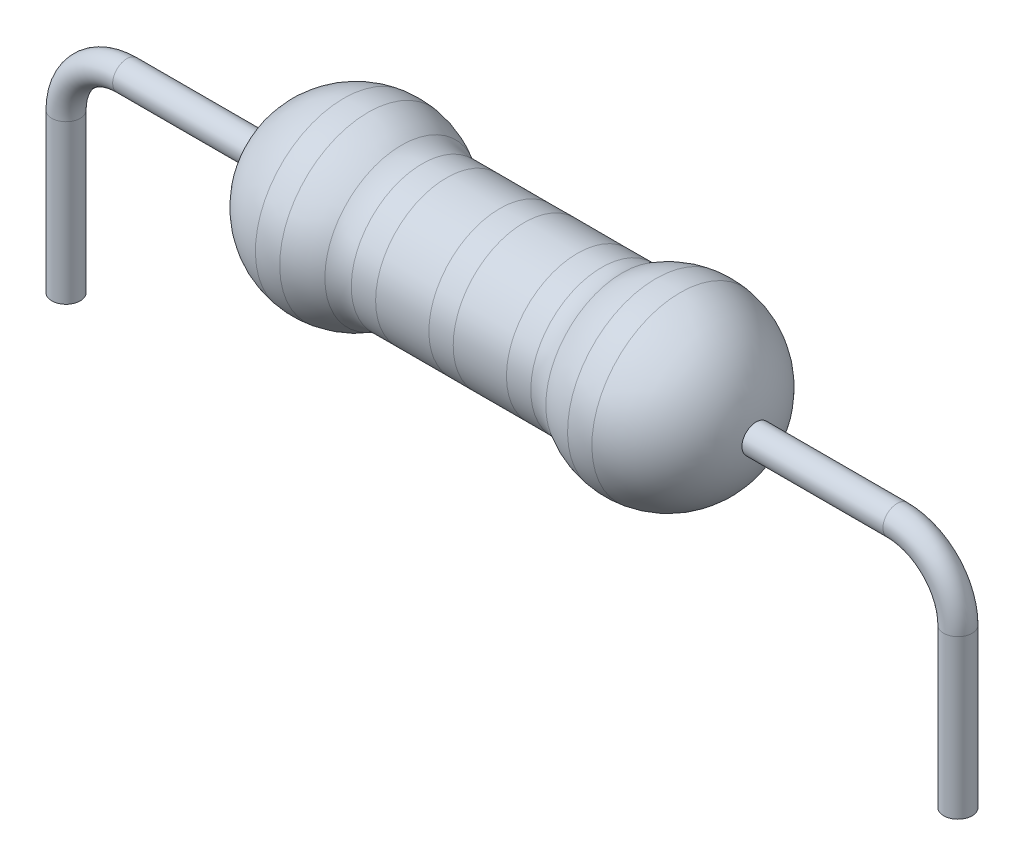
ISO-10303-21;
HEADER;
FILE_DESCRIPTION(('STEP AP214'),'2;1');
FILE_NAME('part.step','',(''),(''),'','','');
FILE_SCHEMA(('AUTOMOTIVE_DESIGN { 1 0 10303 214 1 1 1 1 }'));
ENDSEC;
DATA;
#1=APPLICATION_CONTEXT('core data for automotive mechanical design processes');
#2=APPLICATION_PROTOCOL_DEFINITION('international standard','automotive_design',2000,#1);
#3=PRODUCT_CONTEXT('',#1,'mechanical');
#4=PRODUCT('Part','Part','',(#3));
#5=PRODUCT_RELATED_PRODUCT_CATEGORY('part','',(#4));
#6=PRODUCT_DEFINITION_FORMATION('','',#4);
#7=PRODUCT_DEFINITION_CONTEXT('part definition',#1,'design');
#8=PRODUCT_DEFINITION('design','',#6,#7);
#9=PRODUCT_DEFINITION_SHAPE('','',#8);
#10=(LENGTH_UNIT() NAMED_UNIT(*) SI_UNIT(.MILLI.,.METRE.));
#11=(NAMED_UNIT(*) PLANE_ANGLE_UNIT() SI_UNIT($,.RADIAN.));
#12=(NAMED_UNIT(*) SI_UNIT($,.STERADIAN.) SOLID_ANGLE_UNIT());
#13=UNCERTAINTY_MEASURE_WITH_UNIT(LENGTH_MEASURE(1.E-05),#10,'distance_accuracy_value','');
#14=(GEOMETRIC_REPRESENTATION_CONTEXT(3) GLOBAL_UNCERTAINTY_ASSIGNED_CONTEXT((#13)) GLOBAL_UNIT_ASSIGNED_CONTEXT((#10,
#11,#12)) REPRESENTATION_CONTEXT('',''));
#15=CARTESIAN_POINT('',(0.,0.,0.));
#16=DIRECTION('',(0.,0.,1.));
#17=DIRECTION('',(1.,0.,0.));
#18=AXIS2_PLACEMENT_3D('',#15,#16,#17);
#19=CARTESIAN_POINT('',(-4.74999995071284,0.,0.));
#20=DIRECTION('',(1.,0.,0.));
#21=DIRECTION('',(0.,0.,-1.));
#22=AXIS2_PLACEMENT_3D('',#19,#20,#21);
#23=CYLINDRICAL_SURFACE('',#22,0.175);
#24=CARTESIAN_POINT('',(-3.01099033144867,0.,0.));
#25=DIRECTION('',(1.,0.,0.));
#26=DIRECTION('',(0.,1.,0.));
#27=AXIS2_PLACEMENT_3D('',#24,#25,#26);
#28=CIRCLE('',#27,0.175);
#29=CARTESIAN_POINT('',(-3.01099033144867,0.174999999999999,0.));
#30=VERTEX_POINT('',#29);
#31=EDGE_CURVE('E75',#30,#30,#28,.T.);
#32=ORIENTED_EDGE('',*,*,#31,.F.);
#33=EDGE_LOOP('',(#32));
#34=FACE_BOUND('',#33,.T.);
#35=CARTESIAN_POINT('',(-4.74999995071284,0.,0.));
#36=DIRECTION('',(0.999999999999991,-1.31432424244821E-07,0.));
#37=DIRECTION('',(1.31432424244821E-07,0.999999999999991,0.));
#38=AXIS2_PLACEMENT_3D('',#35,#36,#37);
#39=CIRCLE('',#38,0.175);
#40=CARTESIAN_POINT('',(-4.7499999392125,0.174999999999997,0.));
#41=VERTEX_POINT('',#40);
#42=EDGE_CURVE('E12',#41,#41,#39,.T.);
#43=ORIENTED_EDGE('',*,*,#42,.T.);
#44=EDGE_LOOP('',(#43));
#45=FACE_BOUND('',#44,.T.);
#46=ADVANCED_FACE('F46',(#34,#45),#23,.T.);
#47=CARTESIAN_POINT('',(-3.01099033144867,0.,0.));
#48=DIRECTION('',(1.,0.,0.));
#49=DIRECTION('',(0.,0.,-1.));
#50=AXIS2_PLACEMENT_3D('',#47,#48,#49);
#51=CYLINDRICAL_SURFACE('',#50,0.175);
#52=CARTESIAN_POINT('',(3.01099033144868,0.,0.));
#53=DIRECTION('',(1.,0.,0.));
#54=DIRECTION('',(0.,1.,0.));
#55=AXIS2_PLACEMENT_3D('',#52,#53,#54);
#56=CIRCLE('',#55,0.175);
#57=CARTESIAN_POINT('',(3.01099033144868,0.174999999999999,0.));
#58=VERTEX_POINT('',#57);
#59=EDGE_CURVE('E78',#58,#58,#56,.T.);
#60=ORIENTED_EDGE('',*,*,#59,.F.);
#61=EDGE_LOOP('',(#60));
#62=FACE_BOUND('',#61,.T.);
#63=ORIENTED_EDGE('',*,*,#31,.T.);
#64=EDGE_LOOP('',(#63));
#65=FACE_BOUND('',#64,.T.);
#66=ADVANCED_FACE('F89',(#62,#65),#51,.T.);
#67=CARTESIAN_POINT('',(3.01099033144868,0.,0.));
#68=DIRECTION('',(1.,0.,0.));
#69=DIRECTION('',(0.,0.,-1.));
#70=AXIS2_PLACEMENT_3D('',#67,#68,#69);
#71=CYLINDRICAL_SURFACE('',#70,0.175);
#72=CARTESIAN_POINT('',(4.74999995071284,0.,0.));
#73=DIRECTION('',(1.,0.,0.));
#74=DIRECTION('',(0.,1.,0.));
#75=AXIS2_PLACEMENT_3D('',#72,#73,#74);
#76=CIRCLE('',#75,0.175);
#77=CARTESIAN_POINT('',(4.74999995071284,0.174999999999999,0.));
#78=VERTEX_POINT('',#77);
#79=EDGE_CURVE('E71',#78,#78,#76,.T.);
#80=ORIENTED_EDGE('',*,*,#79,.F.);
#81=EDGE_LOOP('',(#80));
#82=FACE_BOUND('',#81,.T.);
#83=ORIENTED_EDGE('',*,*,#59,.T.);
#84=EDGE_LOOP('',(#83));
#85=FACE_BOUND('',#84,.T.);
#86=ADVANCED_FACE('F86',(#82,#85),#71,.T.);
#87=CARTESIAN_POINT('',(4.74999995071284,-0.75,0.));
#88=DIRECTION('',(0.,0.,-1.));
#89=DIRECTION('',(-1.,0.,0.));
#90=AXIS2_PLACEMENT_3D('',#87,#88,#89);
#91=TOROIDAL_SURFACE('',#90,0.749999999999998,0.175);
#92=CARTESIAN_POINT('',(5.49999995071284,-0.750000000000002,0.));
#93=DIRECTION('',(0.,-1.,0.));
#94=DIRECTION('',(1.,0.,0.));
#95=AXIS2_PLACEMENT_3D('',#92,#93,#94);
#96=CIRCLE('',#95,0.175);
#97=CARTESIAN_POINT('',(5.67499995071284,-0.750000000000003,0.));
#98=VERTEX_POINT('',#97);
#99=EDGE_CURVE('E68',#98,#98,#96,.T.);
#100=CARTESIAN_POINT('',(4.74999995071284,-0.75,0.));
#101=DIRECTION('',(0.,0.,-1.));
#102=DIRECTION('',(-1.,0.,0.));
#103=AXIS2_PLACEMENT_3D('',#100,#101,#102);
#104=CIRCLE('',#103,0.924999999999999);
#105=EDGE_CURVE('',#78,#98,#104,.T.);
#106=ORIENTED_EDGE('',*,*,#79,.T.);
#107=ORIENTED_EDGE('',*,*,#99,.F.);
#108=ORIENTED_EDGE('',*,*,#105,.T.);
#109=ORIENTED_EDGE('',*,*,#105,.F.);
#110=EDGE_LOOP('',(#106,#108,#107,#109));
#111=FACE_BOUND('',#110,.T.);
#112=ADVANCED_FACE('F84',(#111),#91,.T.);
#113=CARTESIAN_POINT('',(5.49999995071284,-0.750000000000002,0.));
#114=DIRECTION('',(0.,-1.,0.));
#115=DIRECTION('',(0.,0.,-1.));
#116=AXIS2_PLACEMENT_3D('',#113,#114,#115);
#117=CYLINDRICAL_SURFACE('',#116,0.175);
#118=CARTESIAN_POINT('',(5.49999995071284,-2.7,0.));
#119=DIRECTION('',(0.,1.,0.));
#120=DIRECTION('',(-1.,0.,0.));
#121=AXIS2_PLACEMENT_3D('',#118,#119,#120);
#122=CIRCLE('',#121,0.175);
#123=CARTESIAN_POINT('',(5.32499995071284,-2.7,0.));
#124=VERTEX_POINT('',#123);
#125=EDGE_CURVE('E73',#124,#124,#122,.F.);
#126=ORIENTED_EDGE('',*,*,#125,.F.);
#127=EDGE_LOOP('',(#126));
#128=FACE_BOUND('',#127,.T.);
#129=ORIENTED_EDGE('',*,*,#99,.T.);
#130=EDGE_LOOP('',(#129));
#131=FACE_BOUND('',#130,.T.);
#132=ADVANCED_FACE('F48',(#128,#131),#117,.T.);
#133=CARTESIAN_POINT('',(-5.50000004928716,-8.7,0.));
#134=DIRECTION('',(0.,1.,0.));
#135=DIRECTION('',(-1.,0.,0.));
#136=AXIS2_PLACEMENT_3D('',#133,#134,#135);
#137=CYLINDRICAL_SURFACE('',#136,0.175);
#138=CARTESIAN_POINT('',(-5.50000004928716,-2.7,0.));
#139=DIRECTION('',(0.,1.,0.));
#140=DIRECTION('',(-1.,0.,0.));
#141=AXIS2_PLACEMENT_3D('',#138,#139,#140);
#142=CIRCLE('',#141,0.175);
#143=CARTESIAN_POINT('',(-5.67500004928716,-2.7,0.));
#144=VERTEX_POINT('',#143);
#145=EDGE_CURVE('E50',#144,#144,#142,.F.);
#146=ORIENTED_EDGE('',*,*,#145,.F.);
#147=EDGE_LOOP('',(#146));
#148=FACE_BOUND('',#147,.T.);
#149=CARTESIAN_POINT('',(-5.50000004928716,-0.750000000000001,0.));
#150=DIRECTION('',(0.,1.,0.));
#151=DIRECTION('',(-1.,0.,0.));
#152=AXIS2_PLACEMENT_3D('',#149,#150,#151);
#153=CIRCLE('',#152,0.175);
#154=CARTESIAN_POINT('',(-5.67500004928716,-0.750000000000001,0.));
#155=VERTEX_POINT('',#154);
#156=EDGE_CURVE('E54',#155,#155,#153,.T.);
#157=ORIENTED_EDGE('',*,*,#156,.F.);
#158=EDGE_LOOP('',(#157));
#159=FACE_BOUND('',#158,.T.);
#160=ADVANCED_FACE('F63',(#148,#159),#137,.T.);
#161=CARTESIAN_POINT('',(-4.75000004928716,-0.75,0.));
#162=DIRECTION('',(0.,0.,-1.));
#163=DIRECTION('',(-1.,0.,0.));
#164=AXIS2_PLACEMENT_3D('',#161,#162,#163);
#165=TOROIDAL_SURFACE('',#164,0.750000000000003,0.175);
#166=ORIENTED_EDGE('',*,*,#42,.F.);
#167=EDGE_LOOP('',(#166));
#168=FACE_BOUND('',#167,.T.);
#169=ORIENTED_EDGE('',*,*,#156,.T.);
#170=EDGE_LOOP('',(#169));
#171=FACE_BOUND('',#170,.T.);
#172=ADVANCED_FACE('F59',(#168,#171),#165,.T.);
#173=CARTESIAN_POINT('',(0.,-2.7,0.));
#174=DIRECTION('',(0.,1.,0.));
#175=DIRECTION('',(-1.,0.,0.));
#176=AXIS2_PLACEMENT_3D('',#173,#174,#175);
#177=PLANE('',#176);
#178=ORIENTED_EDGE('',*,*,#145,.T.);
#179=EDGE_LOOP('',(#178));
#180=FACE_BOUND('',#179,.T.);
#181=ADVANCED_FACE('F62',(#180),#177,.F.);
#182=ORIENTED_EDGE('',*,*,#125,.T.);
#183=EDGE_LOOP('',(#182));
#184=FACE_BOUND('',#183,.T.);
#185=ADVANCED_FACE('F103',(#184),#177,.F.);
#186=CLOSED_SHELL('',(#46,#66,#86,#112,#132,#160,#172,#181,#185));
#187=MANIFOLD_SOLID_BREP('B2',#186);
#188=CARTESIAN_POINT('',(-3.025,0.,0.));
#189=DIRECTION('',(-1.,0.,0.));
#190=DIRECTION('',(0.,-1.,0.));
#191=AXIS2_PLACEMENT_3D('',#188,#189,#190);
#192=CYLINDRICAL_SURFACE('',#191,0.874999999999999);
#193=CARTESIAN_POINT('',(0.80684659140232,0.,0.));
#194=DIRECTION('',(1.,0.,0.));
#195=DIRECTION('',(0.,0.,-1.));
#196=AXIS2_PLACEMENT_3D('',#193,#194,#195);
#197=CIRCLE('',#196,0.874999999999999);
#198=CARTESIAN_POINT('',(0.80684659140232,0.,-0.874999999999999));
#199=VERTEX_POINT('',#198);
#200=EDGE_CURVE('E196',#199,#199,#197,.T.);
#201=ORIENTED_EDGE('',*,*,#200,.F.);
#202=EDGE_LOOP('',(#201));
#203=FACE_BOUND('',#202,.T.);
#204=CARTESIAN_POINT('',(0.15,0.,0.));
#205=DIRECTION('',(-1.,0.,0.));
#206=DIRECTION('',(0.,0.,1.));
#207=AXIS2_PLACEMENT_3D('',#204,#205,#206);
#208=CIRCLE('',#207,0.874999999999999);
#209=CARTESIAN_POINT('',(0.15,0.,0.874999999999999));
#210=VERTEX_POINT('',#209);
#211=EDGE_CURVE('E186',#210,#210,#208,.T.);
#212=ORIENTED_EDGE('',*,*,#211,.F.);
#213=EDGE_LOOP('',(#212));
#214=FACE_BOUND('',#213,.T.);
#215=ADVANCED_FACE('F175',(#203,#214),#192,.T.);
#216=CARTESIAN_POINT('',(-0.80684659140232,0.,0.));
#217=DIRECTION('',(-1.,0.,0.));
#218=DIRECTION('',(0.,0.,1.));
#219=AXIS2_PLACEMENT_3D('',#216,#217,#218);
#220=CIRCLE('',#219,0.874999999999999);
#221=CARTESIAN_POINT('',(-0.80684659140232,0.,0.874999999999999));
#222=VERTEX_POINT('',#221);
#223=EDGE_CURVE('E201',#222,#222,#220,.T.);
#224=ORIENTED_EDGE('',*,*,#223,.F.);
#225=EDGE_LOOP('',(#224));
#226=FACE_BOUND('',#225,.T.);
#227=CARTESIAN_POINT('',(-0.15,0.,0.));
#228=DIRECTION('',(1.,0.,0.));
#229=DIRECTION('',(0.,0.,-1.));
#230=AXIS2_PLACEMENT_3D('',#227,#228,#229);
#231=CIRCLE('',#230,0.874999999999999);
#232=CARTESIAN_POINT('',(-0.15,0.,-0.874999999999999));
#233=VERTEX_POINT('',#232);
#234=EDGE_CURVE('E191',#233,#233,#231,.T.);
#235=ORIENTED_EDGE('',*,*,#234,.F.);
#236=EDGE_LOOP('',(#235));
#237=FACE_BOUND('',#236,.T.);
#238=ADVANCED_FACE('F257',(#226,#237),#192,.T.);
#239=ORIENTED_EDGE('',*,*,#211,.T.);
#240=EDGE_LOOP('',(#239));
#241=FACE_BOUND('',#240,.T.);
#242=ORIENTED_EDGE('',*,*,#234,.T.);
#243=EDGE_LOOP('',(#242));
#244=FACE_BOUND('',#243,.T.);
#245=ADVANCED_FACE('F261',(#241,#244),#192,.T.);
#246=ORIENTED_EDGE('',*,*,#200,.T.);
#247=EDGE_LOOP('',(#246));
#248=FACE_BOUND('',#247,.T.);
#249=CARTESIAN_POINT('',(1.10684659140232,0.,0.));
#250=DIRECTION('',(-1.,0.,0.));
#251=DIRECTION('',(0.,-1.,0.));
#252=AXIS2_PLACEMENT_3D('',#249,#250,#251);
#253=CIRCLE('',#252,0.874999999999999);
#254=CARTESIAN_POINT('',(1.10684659140232,-0.874999999999998,0.));
#255=VERTEX_POINT('',#254);
#256=EDGE_CURVE('E224',#255,#255,#253,.T.);
#257=ORIENTED_EDGE('',*,*,#256,.T.);
#258=EDGE_LOOP('',(#257));
#259=FACE_BOUND('',#258,.T.);
#260=ADVANCED_FACE('F249',(#248,#259),#192,.T.);
#261=CARTESIAN_POINT('',(1.925,0.,0.));
#262=DIRECTION('',(-1.,0.,0.));
#263=DIRECTION('',(0.,1.,0.));
#264=AXIS2_PLACEMENT_3D('',#261,#262,#263);
#265=SPHERICAL_SURFACE('',#264,1.1);
#266=CARTESIAN_POINT('',(1.3625195315891,0.,0.));
#267=DIRECTION('',(-1.,0.,0.));
#268=DIRECTION('',(0.,-1.,0.));
#269=AXIS2_PLACEMENT_3D('',#266,#267,#268);
#270=CIRCLE('',#269,0.945312499999999);
#271=CARTESIAN_POINT('',(1.3625195315891,0.9453125,0.));
#272=VERTEX_POINT('',#271);
#273=EDGE_CURVE('E218',#272,#272,#270,.T.);
#274=CARTESIAN_POINT('',(1.775,0.,0.));
#275=DIRECTION('',(1.,0.,0.));
#276=DIRECTION('',(0.,0.,-1.));
#277=AXIS2_PLACEMENT_3D('',#274,#275,#276);
#278=CIRCLE('',#277,1.08972473588517);
#279=CARTESIAN_POINT('',(1.775,1.08972473588517,0.));
#280=VERTEX_POINT('',#279);
#281=EDGE_CURVE('E205',#280,#280,#278,.T.);
#282=CARTESIAN_POINT('',(1.3625195315891,0.9453125,0.));
#283=CARTESIAN_POINT('',(1.36645794243686,0.947655937694644,0.));
#284=CARTESIAN_POINT('',(1.3704109998934,0.949974760026797,0.));
#285=CARTESIAN_POINT('',(1.37834578695678,0.954562817835994,0.));
#286=CARTESIAN_POINT('',(1.3823275165636,0.956832053313037,0.));
#287=CARTESIAN_POINT('',(1.39031902686026,0.961320581281889,0.));
#288=CARTESIAN_POINT('',(1.39432880755009,0.963539873773696,0.));
#289=CARTESIAN_POINT('',(1.40237579336325,0.967928169519508,0.));
#290=CARTESIAN_POINT('',(1.40641299848658,0.970097172773513,0.));
#291=CARTESIAN_POINT('',(1.41451420255467,0.974384551091025,0.));
#292=CARTESIAN_POINT('',(1.41857820149942,0.976502926154533,0.));
#293=CARTESIAN_POINT('',(1.42673235832645,0.980688717196365,0.));
#294=CARTESIAN_POINT('',(1.43082251620872,0.98275613317469,0.));
#295=CARTESIAN_POINT('',(1.43902835196352,0.986839683072212,0.));
#296=CARTESIAN_POINT('',(1.44314402983604,0.98885581699141,0.));
#297=CARTESIAN_POINT('',(1.4514002626312,0.992836487818565,0.));
#298=CARTESIAN_POINT('',(1.45554081755384,0.994801024726523,0.));
#299=CARTESIAN_POINT('',(1.46384615762456,0.998678194636545,0.));
#300=CARTESIAN_POINT('',(1.46801094277263,1.00059082763861,0.));
#301=CARTESIAN_POINT('',(1.47636409268393,1.00436389095124,0.));
#302=CARTESIAN_POINT('',(1.48055245744714,1.0062243212618,0.));
#303=CARTESIAN_POINT('',(1.488952112295,1.00989268856055,0.));
#304=CARTESIAN_POINT('',(1.49316340237963,1.01170062554874,0.));
#305=CARTESIAN_POINT('',(1.50160824999525,1.01526372377228,0.));
#306=CARTESIAN_POINT('',(1.50584180752623,1.01701888500763,0.));
#307=CARTESIAN_POINT('',(1.51433052868092,1.02047615753949,0.));
#308=CARTESIAN_POINT('',(1.51858569230463,1.02217826883599,0.));
#309=CARTESIAN_POINT('',(1.52711696091591,1.02552917559144,0.));
#310=CARTESIAN_POINT('',(1.53139306590349,1.02717797105039,0.));
#311=CARTESIAN_POINT('',(1.53996554924225,1.03042198856086,0.));
#312=CARTESIAN_POINT('',(1.54426192759343,1.03201721061239,0.));
#313=CARTESIAN_POINT('',(1.55287428649211,1.03515383210724,0.));
#314=CARTESIAN_POINT('',(1.55719026703961,1.03669523155055,0.));
#315=CARTESIAN_POINT('',(1.56584115610141,1.03972396703619,0.));
#316=CARTESIAN_POINT('',(1.57017606461572,1.04121130307852,0.));
#317=CARTESIAN_POINT('',(1.57886413242478,1.04413167941501,0.));
#318=CARTESIAN_POINT('',(1.58321729171954,1.04556471970917,0.));
#319=CARTESIAN_POINT('',(1.59194118105204,1.04837628068411,0.));
#320=CARTESIAN_POINT('',(1.5963119110898,1.04975480136487,0.));
#321=CARTESIAN_POINT('',(1.605070259126,1.05245710776466,0.));
#322=CARTESIAN_POINT('',(1.60945787712445,1.05378089348367,0.));
#323=CARTESIAN_POINT('',(1.61824931566158,1.05637352316212,0.));
#324=CARTESIAN_POINT('',(1.62265313620024,1.05764236712156,0.));
#325=CARTESIAN_POINT('',(1.6314762918662,1.06012491506588,0.));
#326=CARTESIAN_POINT('',(1.6358956269935,1.06133861905076,0.));
#327=CARTESIAN_POINT('',(1.64474912146146,1.06371069744476,0.));
#328=CARTESIAN_POINT('',(1.64918328080214,1.06486907185388,0.));
#329=CARTESIAN_POINT('',(1.65806573100583,1.06713031013866,0.));
#330=CARTESIAN_POINT('',(1.66251402186885,1.06823317401431,0.));
#331=CARTESIAN_POINT('',(1.67142404021865,1.07038321894587,0.));
#332=CARTESIAN_POINT('',(1.67588576770542,1.07143040000179,0.));
#333=CARTESIAN_POINT('',(1.68482196230499,1.0734689157071,0.));
#334=CARTESIAN_POINT('',(1.68929642941777,1.0744602503565,0.));
#335=CARTESIAN_POINT('',(1.69825740428194,1.07638691838288,0.));
#336=CARTESIAN_POINT('',(1.70274391203333,1.07732225175986,0.));
#337=CARTESIAN_POINT('',(1.71172826730453,1.07913677113608,0.));
#338=CARTESIAN_POINT('',(1.71622611482433,1.08001595713532,0.));
#339=CARTESIAN_POINT('',(1.72523244699755,1.08171804437628,0.));
#340=CARTESIAN_POINT('',(1.72974093165096,1.08254094561801,0.));
#341=CARTESIAN_POINT('',(1.73876783376931,1.08413033492706,0.));
#342=CARTESIAN_POINT('',(1.74328625123424,1.08489682299438,0.));
#343=CARTESIAN_POINT('',(1.75233231319739,1.08637326571511,0.));
#344=CARTESIAN_POINT('',(1.75685995769561,1.08708322036851,0.));
#345=CARTESIAN_POINT('',(1.76592376614909,1.08844648722434,0.));
#346=CARTESIAN_POINT('',(1.77045993010435,1.08909979942677,0.));
#347=CARTESIAN_POINT('',(1.775,1.08972473588517,0.));
#348=B_SPLINE_CURVE_WITH_KNOTS('',3,(#282,#283,#284,#285,#286,#287,#288,#289,#290,#291,#292,
#293,#294,#295,#296,#297,#298,#299,#300,#301,#302,#303,#304,#305,#306,#307,#308,#309,#310,#311,
#312,#313,#314,#315,#316,#317,#318,#319,#320,#321,#322,#323,#324,#325,#326,#327,#328,#329,#330,
#331,#332,#333,#334,#335,#336,#337,#338,#339,#340,#341,#342,#343,#344,#345,#346,#347),
.UNSPECIFIED.,.F.,.F.,(4,2,2,2,2,2,2,2,2,2,2,2,2,2,2,2,2,2,2,2,2,2,2,2,2,2,2,2,2,2,2,2,4),(0.,
0.0137485475502791,0.0274970951005586,0.0412456426508379,0.0549941902011173,0.0687427377513967,
0.0824912853016762,0.0962398328519554,0.109988380402235,0.123736927952514,0.137485475502794,
0.151234023053073,0.164982570603352,0.178731118153632,0.192479665703911,0.206228213254191,
0.21997676080447,0.233725308354749,0.247473855905029,0.261222403455308,0.274970951005587,
0.288719498555867,0.302468046106146,0.316216593656426,0.329965141206705,0.343713688756984,
0.357462236307264,0.371210783857543,0.384959331407822,0.398707878958102,0.412456426508381,
0.426204974058661,0.43995352160894),.UNSPECIFIED.);
#349=EDGE_CURVE('BSEAM260',#272,#280,#348,.T.);
#350=ORIENTED_EDGE('',*,*,#273,.F.);
#351=ORIENTED_EDGE('',*,*,#281,.F.);
#352=ORIENTED_EDGE('',*,*,#349,.T.);
#353=ORIENTED_EDGE('',*,*,#349,.F.);
#354=EDGE_LOOP('',(#350,#352,#351,#353));
#355=FACE_BOUND('',#354,.T.);
#356=ADVANCED_FACE('F260',(#355),#265,.T.);
#357=CARTESIAN_POINT('',(3.01099033144867,0.,0.));
#358=DIRECTION('',(-1.,0.,0.));
#359=DIRECTION('',(0.,0.,1.));
#360=AXIS2_PLACEMENT_3D('',#357,#358,#359);
#361=CIRCLE('',#360,0.174999999999998);
#362=CARTESIAN_POINT('',(3.01099033144867,0.174999999999996,0.));
#363=VERTEX_POINT('',#362);
#364=EDGE_CURVE('E45',#363,#363,#361,.T.);
#365=CARTESIAN_POINT('',(2.075,0.,0.));
#366=DIRECTION('',(-1.,0.,0.));
#367=DIRECTION('',(0.,0.,1.));
#368=AXIS2_PLACEMENT_3D('',#365,#366,#367);
#369=CIRCLE('',#368,1.08972473588517);
#370=CARTESIAN_POINT('',(2.075,1.08972473588517,0.));
#371=VERTEX_POINT('',#370);
#372=EDGE_CURVE('E206',#371,#371,#369,.T.);
#373=CARTESIAN_POINT('',(3.01099033144867,0.174999999999996,0.));
#374=CARTESIAN_POINT('',(3.0086676663459,0.189414707336376,0.));
#375=CARTESIAN_POINT('',(3.00605768686556,0.203783104342353,0.));
#376=CARTESIAN_POINT('',(3.00026794948769,0.232404641938725,0.));
#377=CARTESIAN_POINT('',(2.99708819159015,0.246657782529119,0.));
#378=CARTESIAN_POINT('',(2.99016374771585,0.275026171539551,0.));
#379=CARTESIAN_POINT('',(2.98641906173908,0.289141419959589,0.));
#380=CARTESIAN_POINT('',(2.97837074973748,0.317211656452961,0.));
#381=CARTESIAN_POINT('',(2.97406712371265,0.331166644526296,0.));
#382=CARTESIAN_POINT('',(2.96490774094137,0.35889423310967,0.));
#383=CARTESIAN_POINT('',(2.96005198419493,0.37266683361971,0.));
#384=CARTESIAN_POINT('',(2.94979604204133,0.400007812535162,0.));
#385=CARTESIAN_POINT('',(2.94439585663418,0.413576190940574,0.));
#386=CARTESIAN_POINT('',(2.93305961770881,0.440487213940249,0.));
#387=CARTESIAN_POINT('',(2.9271235641906,0.453829858534512,0.));
#388=CARTESIAN_POINT('',(2.91472500041367,0.480268260339474,0.));
#389=CARTESIAN_POINT('',(2.90826249015496,0.493364017550173,0.));
#390=CARTESIAN_POINT('',(2.89482125858558,0.51928788236687,0.));
#391=CARTESIAN_POINT('',(2.88784253727491,0.532115989972866,0.));
#392=CARTESIAN_POINT('',(2.87337994778836,0.557484217712775,0.));
#393=CARTESIAN_POINT('',(2.86589607961247,0.570024337846687,0.));
#394=CARTESIAN_POINT('',(2.85043506142551,0.594796709349777,0.));
#395=CARTESIAN_POINT('',(2.84245791141445,0.607028960718955,0.));
#396=CARTESIAN_POINT('',(2.8260229766499,0.631166201500918,0.));
#397=CARTESIAN_POINT('',(2.81756519189643,0.643071190913702,0.));
#398=CARTESIAN_POINT('',(2.80018239674354,0.666535033436804,0.));
#399=CARTESIAN_POINT('',(2.79125738634412,0.678093886547122,0.));
#400=CARTESIAN_POINT('',(2.77295428974272,0.700847130888917,0.));
#401=CARTESIAN_POINT('',(2.76357620354073,0.712041522120395,0.));
#402=CARTESIAN_POINT('',(2.7443818234905,0.734048094951355,0.));
#403=CARTESIAN_POINT('',(2.73456552964225,0.744860276550838,0.));
#404=CARTESIAN_POINT('',(2.7145102971967,0.766085288325455,0.));
#405=CARTESIAN_POINT('',(2.70427135859941,0.776498118500588,0.));
#406=CARTESIAN_POINT('',(2.68338706962021,0.796907918771797,0.));
#407=CARTESIAN_POINT('',(2.6727417192383,0.80690488886787,0.));
#408=CARTESIAN_POINT('',(2.65106148398556,0.82646711963696,0.));
#409=CARTESIAN_POINT('',(2.64002659911472,0.836032380309975,0.));
#410=CARTESIAN_POINT('',(2.61758478975352,0.854716027327433,0.));
#411=CARTESIAN_POINT('',(2.60617786526316,0.863834413671875,0.));
#412=CARTESIAN_POINT('',(2.58301006136944,0.881609855607865,0.));
#413=CARTESIAN_POINT('',(2.57124918196608,0.890266911199412,0.));
#414=CARTESIAN_POINT('',(2.54739211411819,0.907105966605754,0.));
#415=CARTESIAN_POINT('',(2.53529592567367,0.915287966420548,0.));
#416=CARTESIAN_POINT('',(2.51078741721931,0.93116393841043,0.));
#417=CARTESIAN_POINT('',(2.49837509720946,0.938857910585518,0.));
#418=CARTESIAN_POINT('',(2.47325400429962,0.953745629157532,0.));
#419=CARTESIAN_POINT('',(2.46054523139962,0.960939375554458,0.));
#420=CARTESIAN_POINT('',(2.43485138138659,0.974815237503485,0.));
#421=CARTESIAN_POINT('',(2.42186630427356,0.981497353055585,0.));
#422=CARTESIAN_POINT('',(2.39564043256405,0.994339359371287,0.));
#423=CARTESIAN_POINT('',(2.38239963796758,1.00049925013489,0.));
#424=CARTESIAN_POINT('',(2.35568332345511,1.01228704096278,0.));
#425=CARTESIAN_POINT('',(2.34220780353912,1.01791494102707,0.));
#426=CARTESIAN_POINT('',(2.3150434026286,1.02862982763565,0.));
#427=CARTESIAN_POINT('',(2.30135452163408,1.03371681417995,0.));
#428=CARTESIAN_POINT('',(2.27378510129694,1.0433418097533,0.));
#429=CARTESIAN_POINT('',(2.25990456195432,1.04787981878236,0.));
#430=CARTESIAN_POINT('',(2.23197383067473,1.05639966101017,0.));
#431=CARTESIAN_POINT('',(2.21792363873775,1.06038149420893,0.));
#432=CARTESIAN_POINT('',(2.18967588010799,1.06778268568486,0.));
#433=CARTESIAN_POINT('',(2.1754783134152,1.07120204396204,0.));
#434=CARTESIAN_POINT('',(2.14695830513682,1.07747281311874,0.));
#435=CARTESIAN_POINT('',(2.13263586355123,1.08032422399827,0.));
#436=CARTESIAN_POINT('',(2.10388884671623,1.08545476942481,0.));
#437=CARTESIAN_POINT('',(2.08946427146683,1.08773390397182,0.));
#438=CARTESIAN_POINT('',(2.075,1.08972473588517,0.));
#439=B_SPLINE_CURVE_WITH_KNOTS('',3,(#373,#374,#375,#376,#377,#378,#379,#380,#381,#382,#383,
#384,#385,#386,#387,#388,#389,#390,#391,#392,#393,#394,#395,#396,#397,#398,#399,#400,#401,#402,
#403,#404,#405,#406,#407,#408,#409,#410,#411,#412,#413,#414,#415,#416,#417,#418,#419,#420,#421,
#422,#423,#424,#425,#426,#427,#428,#429,#430,#431,#432,#433,#434,#435,#436,#437,#438),
.UNSPECIFIED.,.F.,.F.,(4,2,2,2,2,2,2,2,2,2,2,2,2,2,2,2,2,2,2,2,2,2,2,2,2,2,2,2,2,2,2,2,4),(0.,
0.0437989938957199,0.0875979877914398,0.13139698168716,0.17519597558288,0.2189949694786,
0.26279396337432,0.30659295727004,0.35039195116576,0.39419094506148,0.4379899389572,
0.48178893285292,0.52558792674864,0.56938692064436,0.61318591454008,0.6569849084358,
0.70078390233152,0.74458289622724,0.78838189012296,0.83218088401868,0.8759798779144,
0.91977887181012,0.96357786570584,1.00737685960156,1.05117585349728,1.094974847393,
1.13877384128872,1.18257283518444,1.22637182908016,1.27017082297588,1.3139698168716,
1.35776881076732,1.40156780466304),.UNSPECIFIED.);
#440=EDGE_CURVE('BSEAM267',#363,#371,#439,.T.);
#441=ORIENTED_EDGE('',*,*,#364,.T.);
#442=ORIENTED_EDGE('',*,*,#372,.F.);
#443=ORIENTED_EDGE('',*,*,#440,.T.);
#444=ORIENTED_EDGE('',*,*,#440,.F.);
#445=EDGE_LOOP('',(#441,#443,#442,#444));
#446=FACE_BOUND('',#445,.T.);
#447=ADVANCED_FACE('F267',(#446),#265,.T.);
#448=CARTESIAN_POINT('',(-1.925,0.,0.));
#449=DIRECTION('',(-1.,0.,0.));
#450=DIRECTION('',(0.,1.,0.));
#451=AXIS2_PLACEMENT_3D('',#448,#449,#450);
#452=SPHERICAL_SURFACE('',#451,1.1);
#453=CARTESIAN_POINT('',(-3.01099033144867,0.,0.));
#454=DIRECTION('',(1.,0.,0.));
#455=DIRECTION('',(0.,0.,-1.));
#456=AXIS2_PLACEMENT_3D('',#453,#454,#455);
#457=CIRCLE('',#456,0.174999999999998);
#458=CARTESIAN_POINT('',(-3.01099033144867,0.174999999999996,0.));
#459=VERTEX_POINT('',#458);
#460=EDGE_CURVE('E182',#459,#459,#457,.T.);
#461=CARTESIAN_POINT('',(-2.075,0.,0.));
#462=DIRECTION('',(1.,0.,0.));
#463=DIRECTION('',(0.,0.,-1.));
#464=AXIS2_PLACEMENT_3D('',#461,#462,#463);
#465=CIRCLE('',#464,1.08972473588517);
#466=CARTESIAN_POINT('',(-2.075,1.08972473588517,0.));
#467=VERTEX_POINT('',#466);
#468=EDGE_CURVE('E210',#467,#467,#465,.T.);
#469=CARTESIAN_POINT('',(-3.01099033144867,0.174999999999996,0.));
#470=CARTESIAN_POINT('',(-3.0086676663459,0.189414707336376,0.));
#471=CARTESIAN_POINT('',(-3.00605768686556,0.203783104342353,0.));
#472=CARTESIAN_POINT('',(-3.00026794948769,0.232404641938724,0.));
#473=CARTESIAN_POINT('',(-2.99708819159015,0.246657782529119,0.));
#474=CARTESIAN_POINT('',(-2.99016374771585,0.275026171539551,0.));
#475=CARTESIAN_POINT('',(-2.98641906173908,0.289141419959588,0.));
#476=CARTESIAN_POINT('',(-2.97837074973748,0.31721165645296,0.));
#477=CARTESIAN_POINT('',(-2.97406712371265,0.331166644526295,0.));
#478=CARTESIAN_POINT('',(-2.96490774094137,0.35889423310967,0.));
#479=CARTESIAN_POINT('',(-2.96005198419493,0.37266683361971,0.));
#480=CARTESIAN_POINT('',(-2.94979604204134,0.400007812535161,0.));
#481=CARTESIAN_POINT('',(-2.94439585663418,0.413576190940573,0.));
#482=CARTESIAN_POINT('',(-2.93305961770881,0.440487213940248,0.));
#483=CARTESIAN_POINT('',(-2.9271235641906,0.453829858534511,0.));
#484=CARTESIAN_POINT('',(-2.91472500041367,0.480268260339474,0.));
#485=CARTESIAN_POINT('',(-2.90826249015496,0.493364017550173,0.));
#486=CARTESIAN_POINT('',(-2.89482125858558,0.519287882366869,0.));
#487=CARTESIAN_POINT('',(-2.88784253727491,0.532115989972866,0.));
#488=CARTESIAN_POINT('',(-2.87337994778836,0.557484217712775,0.));
#489=CARTESIAN_POINT('',(-2.86589607961247,0.570024337846686,0.));
#490=CARTESIAN_POINT('',(-2.85043506142551,0.594796709349777,0.));
#491=CARTESIAN_POINT('',(-2.84245791141445,0.607028960718955,0.));
#492=CARTESIAN_POINT('',(-2.8260229766499,0.631166201500918,0.));
#493=CARTESIAN_POINT('',(-2.81756519189643,0.643071190913702,0.));
#494=CARTESIAN_POINT('',(-2.80018239674354,0.666535033436804,0.));
#495=CARTESIAN_POINT('',(-2.79125738634412,0.678093886547122,0.));
#496=CARTESIAN_POINT('',(-2.77295428974272,0.700847130888917,0.));
#497=CARTESIAN_POINT('',(-2.76357620354073,0.712041522120395,0.));
#498=CARTESIAN_POINT('',(-2.7443818234905,0.734048094951355,0.));
#499=CARTESIAN_POINT('',(-2.73456552964225,0.744860276550838,0.));
#500=CARTESIAN_POINT('',(-2.7145102971967,0.766085288325454,0.));
#501=CARTESIAN_POINT('',(-2.70427135859941,0.776498118500588,0.));
#502=CARTESIAN_POINT('',(-2.68338706962021,0.796907918771797,0.));
#503=CARTESIAN_POINT('',(-2.6727417192383,0.80690488886787,0.));
#504=CARTESIAN_POINT('',(-2.65106148398556,0.82646711963696,0.));
#505=CARTESIAN_POINT('',(-2.64002659911472,0.836032380309975,0.));
#506=CARTESIAN_POINT('',(-2.61758478975352,0.854716027327432,0.));
#507=CARTESIAN_POINT('',(-2.60617786526316,0.863834413671875,0.));
#508=CARTESIAN_POINT('',(-2.58301006136944,0.881609855607865,0.));
#509=CARTESIAN_POINT('',(-2.57124918196608,0.890266911199412,0.));
#510=CARTESIAN_POINT('',(-2.54739211411819,0.907105966605754,0.));
#511=CARTESIAN_POINT('',(-2.53529592567367,0.915287966420548,0.));
#512=CARTESIAN_POINT('',(-2.51078741721931,0.93116393841043,0.));
#513=CARTESIAN_POINT('',(-2.49837509720946,0.938857910585518,0.));
#514=CARTESIAN_POINT('',(-2.47325400429962,0.953745629157532,0.));
#515=CARTESIAN_POINT('',(-2.46054523139962,0.960939375554458,0.));
#516=CARTESIAN_POINT('',(-2.43485138138659,0.974815237503485,0.));
#517=CARTESIAN_POINT('',(-2.42186630427356,0.981497353055585,0.));
#518=CARTESIAN_POINT('',(-2.39564043256405,0.994339359371287,0.));
#519=CARTESIAN_POINT('',(-2.38239963796758,1.00049925013489,0.));
#520=CARTESIAN_POINT('',(-2.35568332345511,1.01228704096278,0.));
#521=CARTESIAN_POINT('',(-2.34220780353912,1.01791494102707,0.));
#522=CARTESIAN_POINT('',(-2.3150434026286,1.02862982763565,0.));
#523=CARTESIAN_POINT('',(-2.30135452163408,1.03371681417995,0.));
#524=CARTESIAN_POINT('',(-2.27378510129694,1.0433418097533,0.));
#525=CARTESIAN_POINT('',(-2.25990456195432,1.04787981878236,0.));
#526=CARTESIAN_POINT('',(-2.23197383067473,1.05639966101017,0.));
#527=CARTESIAN_POINT('',(-2.21792363873775,1.06038149420893,0.));
#528=CARTESIAN_POINT('',(-2.18967588010799,1.06778268568486,0.));
#529=CARTESIAN_POINT('',(-2.1754783134152,1.07120204396204,0.));
#530=CARTESIAN_POINT('',(-2.14695830513682,1.07747281311874,0.));
#531=CARTESIAN_POINT('',(-2.13263586355123,1.08032422399827,0.));
#532=CARTESIAN_POINT('',(-2.10388884671623,1.08545476942481,0.));
#533=CARTESIAN_POINT('',(-2.08946427146683,1.08773390397182,0.));
#534=CARTESIAN_POINT('',(-2.075,1.08972473588517,0.));
#535=B_SPLINE_CURVE_WITH_KNOTS('',3,(#469,#470,#471,#472,#473,#474,#475,#476,#477,#478,#479,
#480,#481,#482,#483,#484,#485,#486,#487,#488,#489,#490,#491,#492,#493,#494,#495,#496,#497,#498,
#499,#500,#501,#502,#503,#504,#505,#506,#507,#508,#509,#510,#511,#512,#513,#514,#515,#516,#517,
#518,#519,#520,#521,#522,#523,#524,#525,#526,#527,#528,#529,#530,#531,#532,#533,#534),
.UNSPECIFIED.,.F.,.F.,(4,2,2,2,2,2,2,2,2,2,2,2,2,2,2,2,2,2,2,2,2,2,2,2,2,2,2,2,2,2,2,2,4),(0.,
0.04379899389572,0.0875979877914401,0.13139698168716,0.17519597558288,0.2189949694786,
0.26279396337432,0.30659295727004,0.35039195116576,0.39419094506148,0.4379899389572,
0.48178893285292,0.52558792674864,0.56938692064436,0.61318591454008,0.6569849084358,
0.70078390233152,0.744582896227241,0.78838189012296,0.83218088401868,0.8759798779144,
0.919778871810121,0.96357786570584,1.00737685960156,1.05117585349728,1.094974847393,
1.13877384128872,1.18257283518444,1.22637182908016,1.27017082297588,1.3139698168716,
1.35776881076732,1.40156780466304),.UNSPECIFIED.);
#536=EDGE_CURVE('BSEAM283',#459,#467,#535,.T.);
#537=ORIENTED_EDGE('',*,*,#460,.T.);
#538=ORIENTED_EDGE('',*,*,#468,.F.);
#539=ORIENTED_EDGE('',*,*,#536,.T.);
#540=ORIENTED_EDGE('',*,*,#536,.F.);
#541=EDGE_LOOP('',(#537,#539,#538,#540));
#542=FACE_BOUND('',#541,.T.);
#543=ADVANCED_FACE('F283',(#542),#452,.T.);
#544=CARTESIAN_POINT('',(-1.3625195315891,0.,0.));
#545=DIRECTION('',(-1.,0.,0.));
#546=DIRECTION('',(0.,-1.,0.));
#547=AXIS2_PLACEMENT_3D('',#544,#545,#546);
#548=CIRCLE('',#547,0.9453125);
#549=CARTESIAN_POINT('',(-1.3625195315891,0.9453125,0.));
#550=VERTEX_POINT('',#549);
#551=EDGE_CURVE('E230',#550,#550,#548,.T.);
#552=CARTESIAN_POINT('',(-1.775,0.,0.));
#553=DIRECTION('',(-1.,0.,0.));
#554=DIRECTION('',(0.,0.,1.));
#555=AXIS2_PLACEMENT_3D('',#552,#553,#554);
#556=CIRCLE('',#555,1.08972473588517);
#557=CARTESIAN_POINT('',(-1.775,1.08972473588517,0.));
#558=VERTEX_POINT('',#557);
#559=EDGE_CURVE('E214',#558,#558,#556,.T.);
#560=CARTESIAN_POINT('',(-1.3625195315891,0.9453125,0.));
#561=CARTESIAN_POINT('',(-1.36645794243686,0.947655937694644,0.));
#562=CARTESIAN_POINT('',(-1.3704109998934,0.949974760026797,0.));
#563=CARTESIAN_POINT('',(-1.37834578695678,0.954562817835994,0.));
#564=CARTESIAN_POINT('',(-1.3823275165636,0.956832053313038,0.));
#565=CARTESIAN_POINT('',(-1.39031902686026,0.961320581281889,0.));
#566=CARTESIAN_POINT('',(-1.39432880755009,0.963539873773697,0.));
#567=CARTESIAN_POINT('',(-1.40237579336325,0.967928169519509,0.));
#568=CARTESIAN_POINT('',(-1.40641299848658,0.970097172773513,0.));
#569=CARTESIAN_POINT('',(-1.41451420255467,0.974384551091025,0.));
#570=CARTESIAN_POINT('',(-1.41857820149942,0.976502926154533,0.));
#571=CARTESIAN_POINT('',(-1.42673235832645,0.980688717196365,0.));
#572=CARTESIAN_POINT('',(-1.43082251620872,0.98275613317469,0.));
#573=CARTESIAN_POINT('',(-1.43902835196352,0.986839683072212,0.));
#574=CARTESIAN_POINT('',(-1.44314402983604,0.98885581699141,0.));
#575=CARTESIAN_POINT('',(-1.4514002626312,0.992836487818565,0.));
#576=CARTESIAN_POINT('',(-1.45554081755384,0.994801024726523,0.));
#577=CARTESIAN_POINT('',(-1.46384615762456,0.998678194636546,0.));
#578=CARTESIAN_POINT('',(-1.46801094277264,1.00059082763861,0.));
#579=CARTESIAN_POINT('',(-1.47636409268393,1.00436389095124,0.));
#580=CARTESIAN_POINT('',(-1.48055245744714,1.0062243212618,0.));
#581=CARTESIAN_POINT('',(-1.488952112295,1.00989268856055,0.));
#582=CARTESIAN_POINT('',(-1.49316340237963,1.01170062554874,0.));
#583=CARTESIAN_POINT('',(-1.50160824999525,1.01526372377228,0.));
#584=CARTESIAN_POINT('',(-1.50584180752623,1.01701888500763,0.));
#585=CARTESIAN_POINT('',(-1.51433052868092,1.02047615753949,0.));
#586=CARTESIAN_POINT('',(-1.51858569230463,1.02217826883599,0.));
#587=CARTESIAN_POINT('',(-1.52711696091591,1.02552917559144,0.));
#588=CARTESIAN_POINT('',(-1.53139306590349,1.02717797105039,0.));
#589=CARTESIAN_POINT('',(-1.53996554924225,1.03042198856086,0.));
#590=CARTESIAN_POINT('',(-1.54426192759343,1.03201721061239,0.));
#591=CARTESIAN_POINT('',(-1.55287428649211,1.03515383210724,0.));
#592=CARTESIAN_POINT('',(-1.55719026703961,1.03669523155055,0.));
#593=CARTESIAN_POINT('',(-1.56584115610141,1.03972396703619,0.));
#594=CARTESIAN_POINT('',(-1.57017606461572,1.04121130307852,0.));
#595=CARTESIAN_POINT('',(-1.57886413242478,1.04413167941501,0.));
#596=CARTESIAN_POINT('',(-1.58321729171954,1.04556471970917,0.));
#597=CARTESIAN_POINT('',(-1.59194118105204,1.04837628068411,0.));
#598=CARTESIAN_POINT('',(-1.5963119110898,1.04975480136487,0.));
#599=CARTESIAN_POINT('',(-1.605070259126,1.05245710776466,0.));
#600=CARTESIAN_POINT('',(-1.60945787712445,1.05378089348367,0.));
#601=CARTESIAN_POINT('',(-1.61824931566158,1.05637352316212,0.));
#602=CARTESIAN_POINT('',(-1.62265313620025,1.05764236712156,0.));
#603=CARTESIAN_POINT('',(-1.63147629186621,1.06012491506588,0.));
#604=CARTESIAN_POINT('',(-1.6358956269935,1.06133861905076,0.));
#605=CARTESIAN_POINT('',(-1.64474912146146,1.06371069744476,0.));
#606=CARTESIAN_POINT('',(-1.64918328080214,1.06486907185388,0.));
#607=CARTESIAN_POINT('',(-1.65806573100583,1.06713031013866,0.));
#608=CARTESIAN_POINT('',(-1.66251402186885,1.06823317401431,0.));
#609=CARTESIAN_POINT('',(-1.67142404021865,1.07038321894587,0.));
#610=CARTESIAN_POINT('',(-1.67588576770542,1.07143040000179,0.));
#611=CARTESIAN_POINT('',(-1.68482196230499,1.0734689157071,0.));
#612=CARTESIAN_POINT('',(-1.68929642941777,1.0744602503565,0.));
#613=CARTESIAN_POINT('',(-1.69825740428194,1.07638691838288,0.));
#614=CARTESIAN_POINT('',(-1.70274391203333,1.07732225175986,0.));
#615=CARTESIAN_POINT('',(-1.71172826730453,1.07913677113608,0.));
#616=CARTESIAN_POINT('',(-1.71622611482433,1.08001595713532,0.));
#617=CARTESIAN_POINT('',(-1.72523244699755,1.08171804437628,0.));
#618=CARTESIAN_POINT('',(-1.72974093165096,1.08254094561801,0.));
#619=CARTESIAN_POINT('',(-1.73876783376931,1.08413033492706,0.));
#620=CARTESIAN_POINT('',(-1.74328625123424,1.08489682299438,0.));
#621=CARTESIAN_POINT('',(-1.75233231319739,1.08637326571511,0.));
#622=CARTESIAN_POINT('',(-1.75685995769561,1.08708322036851,0.));
#623=CARTESIAN_POINT('',(-1.76592376614909,1.08844648722434,0.));
#624=CARTESIAN_POINT('',(-1.77045993010435,1.08909979942677,0.));
#625=CARTESIAN_POINT('',(-1.775,1.08972473588517,0.));
#626=B_SPLINE_CURVE_WITH_KNOTS('',3,(#560,#561,#562,#563,#564,#565,#566,#567,#568,#569,#570,
#571,#572,#573,#574,#575,#576,#577,#578,#579,#580,#581,#582,#583,#584,#585,#586,#587,#588,#589,
#590,#591,#592,#593,#594,#595,#596,#597,#598,#599,#600,#601,#602,#603,#604,#605,#606,#607,#608,
#609,#610,#611,#612,#613,#614,#615,#616,#617,#618,#619,#620,#621,#622,#623,#624,#625),
.UNSPECIFIED.,.F.,.F.,(4,2,2,2,2,2,2,2,2,2,2,2,2,2,2,2,2,2,2,2,2,2,2,2,2,2,2,2,2,2,2,2,4),(0.,
0.0137485475502792,0.0274970951005588,0.0412456426508382,0.0549941902011174,0.0687427377513968,
0.0824912853016762,0.0962398328519554,0.109988380402235,0.123736927952514,0.137485475502794,
0.151234023053073,0.164982570603352,0.178731118153632,0.192479665703911,0.20622821325419,
0.21997676080447,0.233725308354749,0.247473855905029,0.261222403455308,0.274970951005587,
0.288719498555867,0.302468046106146,0.316216593656425,0.329965141206705,0.343713688756984,
0.357462236307263,0.371210783857543,0.384959331407822,0.398707878958102,0.412456426508381,
0.42620497405866,0.43995352160894),.UNSPECIFIED.);
#627=EDGE_CURVE('BSEAM234',#550,#558,#626,.T.);
#628=ORIENTED_EDGE('',*,*,#551,.T.);
#629=ORIENTED_EDGE('',*,*,#559,.F.);
#630=ORIENTED_EDGE('',*,*,#627,.T.);
#631=ORIENTED_EDGE('',*,*,#627,.F.);
#632=EDGE_LOOP('',(#628,#630,#629,#631));
#633=FACE_BOUND('',#632,.T.);
#634=ADVANCED_FACE('F234',(#633),#452,.T.);
#635=CARTESIAN_POINT('',(-2.075,1.08972473588517,0.));
#636=CARTESIAN_POINT('',(-2.07189451550306,1.09015220444314,0.));
#637=CARTESIAN_POINT('',(-2.06878720362638,1.09056639735688,0.));
#638=CARTESIAN_POINT('',(-2.06256915242821,1.09136820315426,0.));
#639=CARTESIAN_POINT('',(-2.05945841310672,1.0917558160379,0.));
#640=CARTESIAN_POINT('',(-2.05323373433362,1.09250443303344,0.));
#641=CARTESIAN_POINT('',(-2.050119794882,1.09286543714534,0.));
#642=CARTESIAN_POINT('',(-2.04388894346434,1.0935608103212,0.));
#643=CARTESIAN_POINT('',(-2.04077203149829,1.09389517938516,0.));
#644=CARTESIAN_POINT('',(-2.03453546286676,1.09453725799621,0.));
#645=CARTESIAN_POINT('',(-2.03141580620127,1.09484496754331,0.));
#646=CARTESIAN_POINT('',(-2.02517397619126,1.0954337046377,0.));
#647=CARTESIAN_POINT('',(-2.02205180284673,1.09571473218499,0.));
#648=CARTESIAN_POINT('',(-2.01580516768173,1.096250084737,0.));
#649=CARTESIAN_POINT('',(-2.01268070586124,1.09650440974173,0.));
#650=CARTESIAN_POINT('',(-2.00642972211499,1.09698633862027,0.));
#651=CARTESIAN_POINT('',(-2.00330320018923,1.09721394249409,0.));
#652=CARTESIAN_POINT('',(-1.99704832475359,1.09764241247481,0.));
#653=CARTESIAN_POINT('',(-1.99391997124371,1.09784327858173,0.));
#654=CARTESIAN_POINT('',(-1.98766166129491,1.09821825834716,0.));
#655=CARTESIAN_POINT('',(-1.98453170485598,1.09839237200567,0.));
#656=CARTESIAN_POINT('',(-1.97827041782129,1.09871383414812,0.));
#657=CARTESIAN_POINT('',(-1.97513908722553,1.09886118263205,0.));
#658=CARTESIAN_POINT('',(-1.96887528074983,1.09912910365545,0.));
#659=CARTESIAN_POINT('',(-1.9657428048699,1.09924967619492,0.));
#660=CARTESIAN_POINT('',(-1.95947693678221,1.09946403651662,0.));
#661=CARTESIAN_POINT('',(-1.95634354457447,1.09955782429885,0.));
#662=CARTESIAN_POINT('',(-1.9500760728545,1.09971860825099,0.));
#663=CARTESIAN_POINT('',(-1.94694199334229,1.09978560442091,0.));
#664=CARTESIAN_POINT('',(-1.94067337608697,1.09989280025162,0.));
#665=CARTESIAN_POINT('',(-1.93753883834387,1.0999329999124,0.));
#666=CARTESIAN_POINT('',(-1.93126953373385,1.09998659978659,0.));
#667=CARTESIAN_POINT('',(-1.92813476686692,1.1,0.));
#668=CARTESIAN_POINT('',(-1.92186523313308,1.1,0.));
#669=CARTESIAN_POINT('',(-1.91873046626616,1.09998659978659,0.));
#670=CARTESIAN_POINT('',(-1.91246116165614,1.0999329999124,0.));
#671=CARTESIAN_POINT('',(-1.90932662391304,1.09989280025162,0.));
#672=CARTESIAN_POINT('',(-1.90305800665772,1.09978560442092,0.));
#673=CARTESIAN_POINT('',(-1.8999239271455,1.099718608251,0.));
#674=CARTESIAN_POINT('',(-1.89365645542554,1.09955782429885,0.));
#675=CARTESIAN_POINT('',(-1.8905230632178,1.09946403651662,0.));
#676=CARTESIAN_POINT('',(-1.88425719513011,1.09924967619492,0.));
#677=CARTESIAN_POINT('',(-1.88112471925017,1.09912910365545,0.));
#678=CARTESIAN_POINT('',(-1.87486091277448,1.09886118263205,0.));
#679=CARTESIAN_POINT('',(-1.87172958217871,1.09871383414812,0.));
#680=CARTESIAN_POINT('',(-1.86546829514403,1.09839237200567,0.));
#681=CARTESIAN_POINT('',(-1.8623383387051,1.09821825834716,0.));
#682=CARTESIAN_POINT('',(-1.85608002875629,1.09784327858173,0.));
#683=CARTESIAN_POINT('',(-1.85295167524642,1.09764241247482,0.));
#684=CARTESIAN_POINT('',(-1.84669679981078,1.09721394249409,0.));
#685=CARTESIAN_POINT('',(-1.84357027788501,1.09698633862027,0.));
#686=CARTESIAN_POINT('',(-1.83731929413877,1.09650440974173,0.));
#687=CARTESIAN_POINT('',(-1.83419483231828,1.09625008473701,0.));
#688=CARTESIAN_POINT('',(-1.82794819715327,1.09571473218499,0.));
#689=CARTESIAN_POINT('',(-1.82482602380875,1.0954337046377,0.));
#690=CARTESIAN_POINT('',(-1.81858419379874,1.09484496754331,0.));
#691=CARTESIAN_POINT('',(-1.81546453713325,1.09453725799621,0.));
#692=CARTESIAN_POINT('',(-1.80922796850172,1.09389517938516,0.));
#693=CARTESIAN_POINT('',(-1.80611105653567,1.0935608103212,0.));
#694=CARTESIAN_POINT('',(-1.79988020511801,1.09286543714534,0.));
#695=CARTESIAN_POINT('',(-1.79676626566639,1.09250443303344,0.));
#696=CARTESIAN_POINT('',(-1.79054158689329,1.0917558160379,0.));
#697=CARTESIAN_POINT('',(-1.7874308475718,1.09136820315426,0.));
#698=CARTESIAN_POINT('',(-1.78121279637363,1.09056639735688,0.));
#699=CARTESIAN_POINT('',(-1.77810548449695,1.09015220444314,0.));
#700=CARTESIAN_POINT('',(-1.775,1.08972473588517,0.));
#701=B_SPLINE_CURVE_WITH_KNOTS('',3,(#635,#636,#637,#638,#639,#640,#641,#642,#643,#644,#645,
#646,#647,#648,#649,#650,#651,#652,#653,#654,#655,#656,#657,#658,#659,#660,#661,#662,#663,#664,
#665,#666,#667,#668,#669,#670,#671,#672,#673,#674,#675,#676,#677,#678,#679,#680,#681,#682,#683,
#684,#685,#686,#687,#688,#689,#690,#691,#692,#693,#694,#695,#696,#697,#698,#699,#700),
.UNSPECIFIED.,.F.,.F.,(4,2,2,2,2,2,2,2,2,2,2,2,2,2,2,2,2,2,2,2,2,2,2,2,2,2,2,2,2,2,2,2,4),(0.,
0.00940427196041611,0.0188085439208328,0.0282128158812492,0.0376170878416655,0.0470213598020818,
0.0564256317624983,0.0658299037229144,0.075234175683331,0.0846384476437474,0.0940427196041635,
0.10344699156458,0.112851263524996,0.122255535485413,0.131659807445829,0.141064079406246,
0.150468351366662,0.159872623327078,0.169276895287495,0.178681167247911,0.188085439208328,
0.197489711168744,0.20689398312916,0.216298255089577,0.225702527049993,0.235106799010409,
0.244511070970826,0.253915342931242,0.263319614891659,0.272723886852075,0.282128158812492,
0.291532430772908,0.300936702733324),.UNSPECIFIED.);
#702=EDGE_CURVE('BSEAM177',#467,#558,#701,.T.);
#703=ORIENTED_EDGE('',*,*,#468,.T.);
#704=ORIENTED_EDGE('',*,*,#559,.T.);
#705=ORIENTED_EDGE('',*,*,#702,.T.);
#706=ORIENTED_EDGE('',*,*,#702,.F.);
#707=EDGE_LOOP('',(#703,#705,#704,#706));
#708=FACE_BOUND('',#707,.T.);
#709=ADVANCED_FACE('F177',(#708),#452,.T.);
#710=CARTESIAN_POINT('',(1.775,1.08972473588517,0.));
#711=CARTESIAN_POINT('',(1.77810548449695,1.09015220444314,0.));
#712=CARTESIAN_POINT('',(1.78121279637363,1.09056639735688,0.));
#713=CARTESIAN_POINT('',(1.7874308475718,1.09136820315426,0.));
#714=CARTESIAN_POINT('',(1.79054158689329,1.0917558160379,0.));
#715=CARTESIAN_POINT('',(1.79676626566639,1.09250443303344,0.));
#716=CARTESIAN_POINT('',(1.79988020511801,1.09286543714534,0.));
#717=CARTESIAN_POINT('',(1.80611105653567,1.0935608103212,0.));
#718=CARTESIAN_POINT('',(1.80922796850172,1.09389517938516,0.));
#719=CARTESIAN_POINT('',(1.81546453713325,1.09453725799621,0.));
#720=CARTESIAN_POINT('',(1.81858419379874,1.09484496754331,0.));
#721=CARTESIAN_POINT('',(1.82482602380875,1.0954337046377,0.));
#722=CARTESIAN_POINT('',(1.82794819715327,1.09571473218499,0.));
#723=CARTESIAN_POINT('',(1.83419483231828,1.09625008473701,0.));
#724=CARTESIAN_POINT('',(1.83731929413877,1.09650440974173,0.));
#725=CARTESIAN_POINT('',(1.84357027788501,1.09698633862027,0.));
#726=CARTESIAN_POINT('',(1.84669679981078,1.09721394249409,0.));
#727=CARTESIAN_POINT('',(1.85295167524642,1.09764241247482,0.));
#728=CARTESIAN_POINT('',(1.85608002875629,1.09784327858173,0.));
#729=CARTESIAN_POINT('',(1.8623383387051,1.09821825834716,0.));
#730=CARTESIAN_POINT('',(1.86546829514403,1.09839237200567,0.));
#731=CARTESIAN_POINT('',(1.87172958217871,1.09871383414812,0.));
#732=CARTESIAN_POINT('',(1.87486091277448,1.09886118263205,0.));
#733=CARTESIAN_POINT('',(1.88112471925017,1.09912910365545,0.));
#734=CARTESIAN_POINT('',(1.88425719513011,1.09924967619492,0.));
#735=CARTESIAN_POINT('',(1.8905230632178,1.09946403651662,0.));
#736=CARTESIAN_POINT('',(1.89365645542554,1.09955782429885,0.));
#737=CARTESIAN_POINT('',(1.8999239271455,1.099718608251,0.));
#738=CARTESIAN_POINT('',(1.90305800665772,1.09978560442092,0.));
#739=CARTESIAN_POINT('',(1.90932662391304,1.09989280025162,0.));
#740=CARTESIAN_POINT('',(1.91246116165614,1.0999329999124,0.));
#741=CARTESIAN_POINT('',(1.91873046626616,1.09998659978659,0.));
#742=CARTESIAN_POINT('',(1.92186523313308,1.1,0.));
#743=CARTESIAN_POINT('',(1.92813476686692,1.1,0.));
#744=CARTESIAN_POINT('',(1.93126953373385,1.09998659978659,0.));
#745=CARTESIAN_POINT('',(1.93753883834387,1.0999329999124,0.));
#746=CARTESIAN_POINT('',(1.94067337608697,1.09989280025162,0.));
#747=CARTESIAN_POINT('',(1.94694199334229,1.09978560442091,0.));
#748=CARTESIAN_POINT('',(1.9500760728545,1.099718608251,0.));
#749=CARTESIAN_POINT('',(1.95634354457447,1.09955782429885,0.));
#750=CARTESIAN_POINT('',(1.95947693678221,1.09946403651662,0.));
#751=CARTESIAN_POINT('',(1.9657428048699,1.09924967619492,0.));
#752=CARTESIAN_POINT('',(1.96887528074983,1.09912910365545,0.));
#753=CARTESIAN_POINT('',(1.97513908722553,1.09886118263205,0.));
#754=CARTESIAN_POINT('',(1.97827041782129,1.09871383414812,0.));
#755=CARTESIAN_POINT('',(1.98453170485598,1.09839237200567,0.));
#756=CARTESIAN_POINT('',(1.98766166129491,1.09821825834716,0.));
#757=CARTESIAN_POINT('',(1.99391997124371,1.09784327858173,0.));
#758=CARTESIAN_POINT('',(1.99704832475359,1.09764241247481,0.));
#759=CARTESIAN_POINT('',(2.00330320018923,1.09721394249409,0.));
#760=CARTESIAN_POINT('',(2.00642972211499,1.09698633862027,0.));
#761=CARTESIAN_POINT('',(2.01268070586124,1.09650440974173,0.));
#762=CARTESIAN_POINT('',(2.01580516768173,1.096250084737,0.));
#763=CARTESIAN_POINT('',(2.02205180284673,1.09571473218499,0.));
#764=CARTESIAN_POINT('',(2.02517397619126,1.0954337046377,0.));
#765=CARTESIAN_POINT('',(2.03141580620127,1.09484496754331,0.));
#766=CARTESIAN_POINT('',(2.03453546286676,1.09453725799621,0.));
#767=CARTESIAN_POINT('',(2.04077203149829,1.09389517938516,0.));
#768=CARTESIAN_POINT('',(2.04388894346434,1.0935608103212,0.));
#769=CARTESIAN_POINT('',(2.050119794882,1.09286543714534,0.));
#770=CARTESIAN_POINT('',(2.05323373433362,1.09250443303344,0.));
#771=CARTESIAN_POINT('',(2.05945841310672,1.0917558160379,0.));
#772=CARTESIAN_POINT('',(2.06256915242821,1.09136820315426,0.));
#773=CARTESIAN_POINT('',(2.06878720362638,1.09056639735688,0.));
#774=CARTESIAN_POINT('',(2.07189451550306,1.09015220444314,0.));
#775=CARTESIAN_POINT('',(2.075,1.08972473588517,0.));
#776=B_SPLINE_CURVE_WITH_KNOTS('',3,(#710,#711,#712,#713,#714,#715,#716,#717,#718,#719,#720,
#721,#722,#723,#724,#725,#726,#727,#728,#729,#730,#731,#732,#733,#734,#735,#736,#737,#738,#739,
#740,#741,#742,#743,#744,#745,#746,#747,#748,#749,#750,#751,#752,#753,#754,#755,#756,#757,#758,
#759,#760,#761,#762,#763,#764,#765,#766,#767,#768,#769,#770,#771,#772,#773,#774,#775),
.UNSPECIFIED.,.F.,.F.,(4,2,2,2,2,2,2,2,2,2,2,2,2,2,2,2,2,2,2,2,2,2,2,2,2,2,2,2,2,2,2,2,4),(0.,
0.00940427196041633,0.0188085439208327,0.0282128158812492,0.0376170878416654,0.0470213598020819,
0.0564256317624983,0.0658299037229146,0.0752341756833309,0.0846384476437473,0.0940427196041637,
0.10344699156458,0.112851263524997,0.122255535485413,0.131659807445829,0.141064079406246,
0.150468351366662,0.159872623327079,0.169276895287495,0.178681167247911,0.188085439208328,
0.197489711168744,0.20689398312916,0.216298255089577,0.225702527049993,0.23510679901041,
0.244511070970826,0.253915342931242,0.263319614891659,0.272723886852075,0.282128158812491,
0.291532430772908,0.300936702733324),.UNSPECIFIED.);
#777=EDGE_CURVE('BSEAM253',#280,#371,#776,.T.);
#778=ORIENTED_EDGE('',*,*,#281,.T.);
#779=ORIENTED_EDGE('',*,*,#372,.T.);
#780=ORIENTED_EDGE('',*,*,#777,.T.);
#781=ORIENTED_EDGE('',*,*,#777,.F.);
#782=EDGE_LOOP('',(#778,#780,#779,#781));
#783=FACE_BOUND('',#782,.T.);
#784=ADVANCED_FACE('F253',(#783),#265,.T.);
#785=CARTESIAN_POINT('',(1.10684659140232,0.,0.));
#786=DIRECTION('',(-1.,0.,0.));
#787=DIRECTION('',(0.,-1.,0.));
#788=AXIS2_PLACEMENT_3D('',#785,#786,#787);
#789=TOROIDAL_SURFACE('',#788,1.375,0.5);
#790=ORIENTED_EDGE('',*,*,#256,.F.);
#791=EDGE_LOOP('',(#790));
#792=FACE_BOUND('',#791,.T.);
#793=ORIENTED_EDGE('',*,*,#273,.T.);
#794=EDGE_LOOP('',(#793));
#795=FACE_BOUND('',#794,.T.);
#796=ADVANCED_FACE('F246',(#792,#795),#789,.F.);
#797=ORIENTED_EDGE('',*,*,#223,.T.);
#798=EDGE_LOOP('',(#797));
#799=FACE_BOUND('',#798,.T.);
#800=CARTESIAN_POINT('',(-1.10684659140232,0.,0.));
#801=DIRECTION('',(-1.,0.,0.));
#802=DIRECTION('',(0.,-1.,0.));
#803=AXIS2_PLACEMENT_3D('',#800,#801,#802);
#804=CIRCLE('',#803,0.875);
#805=CARTESIAN_POINT('',(-1.10684659140232,-0.874999999999999,0.));
#806=VERTEX_POINT('',#805);
#807=EDGE_CURVE('E227',#806,#806,#804,.T.);
#808=ORIENTED_EDGE('',*,*,#807,.F.);
#809=EDGE_LOOP('',(#808));
#810=FACE_BOUND('',#809,.T.);
#811=ADVANCED_FACE('F241',(#799,#810),#192,.T.);
#812=CARTESIAN_POINT('',(-1.10684659140232,0.,0.));
#813=DIRECTION('',(-1.,0.,0.));
#814=DIRECTION('',(0.,-1.,0.));
#815=AXIS2_PLACEMENT_3D('',#812,#813,#814);
#816=TOROIDAL_SURFACE('',#815,1.375,0.5);
#817=ORIENTED_EDGE('',*,*,#551,.F.);
#818=EDGE_LOOP('',(#817));
#819=FACE_BOUND('',#818,.T.);
#820=ORIENTED_EDGE('',*,*,#807,.T.);
#821=EDGE_LOOP('',(#820));
#822=FACE_BOUND('',#821,.T.);
#823=ADVANCED_FACE('F237',(#819,#822),#816,.F.);
#824=CARTESIAN_POINT('',(-3.01099033144867,-1.1,0.175));
#825=DIRECTION('',(1.,0.,0.));
#826=DIRECTION('',(0.,0.,-1.));
#827=AXIS2_PLACEMENT_3D('',#824,#825,#826);
#828=PLANE('',#827);
#829=ORIENTED_EDGE('',*,*,#460,.F.);
#830=EDGE_LOOP('',(#829));
#831=FACE_BOUND('',#830,.T.);
#832=ADVANCED_FACE('F240',(#831),#828,.F.);
#833=CARTESIAN_POINT('',(3.01099033144867,-1.1,0.175));
#834=DIRECTION('',(-1.,0.,0.));
#835=DIRECTION('',(0.,0.,1.));
#836=AXIS2_PLACEMENT_3D('',#833,#834,#835);
#837=PLANE('',#836);
#838=ORIENTED_EDGE('',*,*,#364,.F.);
#839=EDGE_LOOP('',(#838));
#840=FACE_BOUND('',#839,.T.);
#841=ADVANCED_FACE('F389',(#840),#837,.F.);
#842=CLOSED_SHELL('',(#215,#238,#245,#260,#356,#447,#543,#634,#709,#784,#796,#811,#823,#832,#841));
#843=MANIFOLD_SOLID_BREP('B6',#842);
#844=ADVANCED_BREP_SHAPE_REPRESENTATION('',(#18,#187,#843),#14);
#845=SHAPE_DEFINITION_REPRESENTATION(#9,#844);
ENDSEC;
END-ISO-10303-21;
